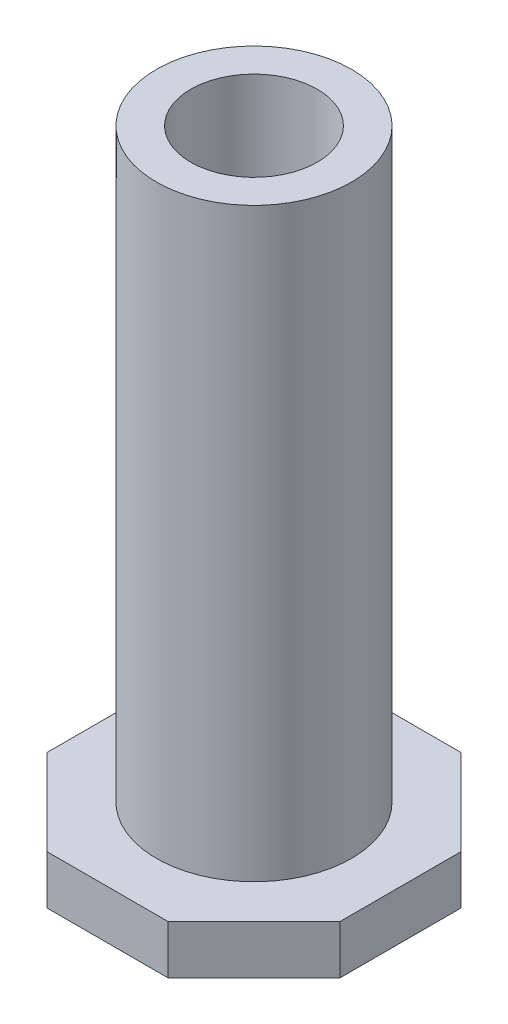
ISO-10303-21;
HEADER;
FILE_DESCRIPTION(('STEP AP214'),'2;1');
FILE_NAME('part.step','',(''),(''),'','','');
FILE_SCHEMA(('AUTOMOTIVE_DESIGN { 1 0 10303 214 1 1 1 1 }'));
ENDSEC;
DATA;
#1=APPLICATION_CONTEXT('core data for automotive mechanical design processes');
#2=APPLICATION_PROTOCOL_DEFINITION('international standard','automotive_design',2000,#1);
#3=PRODUCT_CONTEXT('',#1,'mechanical');
#4=PRODUCT('Part','Part','',(#3));
#5=PRODUCT_RELATED_PRODUCT_CATEGORY('part','',(#4));
#6=PRODUCT_DEFINITION_FORMATION('','',#4);
#7=PRODUCT_DEFINITION_CONTEXT('part definition',#1,'design');
#8=PRODUCT_DEFINITION('design','',#6,#7);
#9=PRODUCT_DEFINITION_SHAPE('','',#8);
#10=(LENGTH_UNIT() NAMED_UNIT(*) SI_UNIT(.MILLI.,.METRE.));
#11=(NAMED_UNIT(*) PLANE_ANGLE_UNIT() SI_UNIT($,.RADIAN.));
#12=(NAMED_UNIT(*) SI_UNIT($,.STERADIAN.) SOLID_ANGLE_UNIT());
#13=UNCERTAINTY_MEASURE_WITH_UNIT(LENGTH_MEASURE(1.E-05),#10,'distance_accuracy_value','');
#14=(GEOMETRIC_REPRESENTATION_CONTEXT(3) GLOBAL_UNCERTAINTY_ASSIGNED_CONTEXT((#13)) GLOBAL_UNIT_ASSIGNED_CONTEXT((#10,
#11,#12)) REPRESENTATION_CONTEXT('',''));
#15=CARTESIAN_POINT('',(0.,0.,0.));
#16=DIRECTION('',(0.,0.,1.));
#17=DIRECTION('',(1.,0.,0.));
#18=AXIS2_PLACEMENT_3D('',#15,#16,#17);
#19=CARTESIAN_POINT('',(0.,1.5875,0.));
#20=DIRECTION('',(0.,1.,0.));
#21=DIRECTION('',(0.,0.,1.));
#22=AXIS2_PLACEMENT_3D('',#19,#20,#21);
#23=PLANE('',#22);
#24=DIRECTION('',(0.707106781186547,0.,-0.707106781186548));
#25=VECTOR('',#24,1.);
#26=CARTESIAN_POINT('',(1.97269209080187,1.5875,4.7625));
#27=LINE('',#26,#25);
#28=CARTESIAN_POINT('',(1.97269209080187,1.5875,4.7625));
#29=VERTEX_POINT('',#28);
#30=CARTESIAN_POINT('',(4.7625,1.5875,1.97269209080187));
#31=VERTEX_POINT('',#30);
#32=EDGE_CURVE('E144',#29,#31,#27,.T.);
#33=ORIENTED_EDGE('',*,*,#32,.T.);
#34=DIRECTION('',(0.,0.,-1.));
#35=VECTOR('',#34,1.);
#36=CARTESIAN_POINT('',(4.7625,1.5875,1.97269209080187));
#37=LINE('',#36,#35);
#38=CARTESIAN_POINT('',(4.7625,1.5875,-1.97269209080187));
#39=VERTEX_POINT('',#38);
#40=EDGE_CURVE('E92',#31,#39,#37,.T.);
#41=ORIENTED_EDGE('',*,*,#40,.T.);
#42=DIRECTION('',(-0.707106781186548,0.,-0.707106781186547));
#43=VECTOR('',#42,1.);
#44=CARTESIAN_POINT('',(4.7625,1.5875,-1.97269209080187));
#45=LINE('',#44,#43);
#46=CARTESIAN_POINT('',(1.97269209080186,1.5875,-4.7625));
#47=VERTEX_POINT('',#46);
#48=EDGE_CURVE('E159',#39,#47,#45,.T.);
#49=ORIENTED_EDGE('',*,*,#48,.T.);
#50=DIRECTION('',(-1.,0.,0.));
#51=VECTOR('',#50,1.);
#52=CARTESIAN_POINT('',(1.97269209080186,1.5875,-4.7625));
#53=LINE('',#52,#51);
#54=CARTESIAN_POINT('',(-1.97269209080187,1.5875,-4.7625));
#55=VERTEX_POINT('',#54);
#56=EDGE_CURVE('E171',#47,#55,#53,.T.);
#57=ORIENTED_EDGE('',*,*,#56,.T.);
#58=DIRECTION('',(-0.707106781186547,0.,0.707106781186548));
#59=VECTOR('',#58,1.);
#60=CARTESIAN_POINT('',(-1.97269209080187,1.5875,-4.7625));
#61=LINE('',#60,#59);
#62=CARTESIAN_POINT('',(-4.7625,1.5875,-1.97269209080187));
#63=VERTEX_POINT('',#62);
#64=EDGE_CURVE('E111',#55,#63,#61,.T.);
#65=ORIENTED_EDGE('',*,*,#64,.T.);
#66=DIRECTION('',(0.,0.,1.));
#67=VECTOR('',#66,1.);
#68=CARTESIAN_POINT('',(-4.7625,1.5875,-1.97269209080187));
#69=LINE('',#68,#67);
#70=CARTESIAN_POINT('',(-4.7625,1.5875,1.97269209080187));
#71=VERTEX_POINT('',#70);
#72=EDGE_CURVE('E105',#63,#71,#69,.T.);
#73=ORIENTED_EDGE('',*,*,#72,.T.);
#74=DIRECTION('',(0.707106781186548,0.,0.707106781186547));
#75=VECTOR('',#74,1.);
#76=CARTESIAN_POINT('',(-4.7625,1.5875,1.97269209080187));
#77=LINE('',#76,#75);
#78=CARTESIAN_POINT('',(-1.97269209080186,1.5875,4.7625));
#79=VERTEX_POINT('',#78);
#80=EDGE_CURVE('E109',#71,#79,#77,.T.);
#81=ORIENTED_EDGE('',*,*,#80,.T.);
#82=DIRECTION('',(1.,0.,0.));
#83=VECTOR('',#82,1.);
#84=CARTESIAN_POINT('',(-1.97269209080186,1.5875,4.7625));
#85=LINE('',#84,#83);
#86=EDGE_CURVE('E49',#79,#29,#85,.T.);
#87=ORIENTED_EDGE('',*,*,#86,.T.);
#88=EDGE_LOOP('',(#33,#41,#49,#57,#65,#73,#81,#87));
#89=FACE_BOUND('',#88,.T.);
#90=CARTESIAN_POINT('',(0.,1.5875,0.));
#91=DIRECTION('',(0.,1.,0.));
#92=DIRECTION('',(0.,0.,1.));
#93=AXIS2_PLACEMENT_3D('',#90,#91,#92);
#94=CIRCLE('',#93,3.175);
#95=CARTESIAN_POINT('',(0.,1.5875,-3.175));
#96=VERTEX_POINT('',#95);
#97=EDGE_CURVE('E177',#96,#96,#94,.T.);
#98=ORIENTED_EDGE('',*,*,#97,.F.);
#99=EDGE_LOOP('',(#98));
#100=FACE_BOUND('',#99,.T.);
#101=ADVANCED_FACE('F32',(#89,#100),#23,.T.);
#102=CARTESIAN_POINT('',(1.97269209080187,1.5875,4.7625));
#103=DIRECTION('',(-0.707106781186548,0.,-0.707106781186547));
#104=DIRECTION('',(-0.707106781186547,0.,0.707106781186548));
#105=AXIS2_PLACEMENT_3D('',#102,#103,#104);
#106=PLANE('',#105);
#107=DIRECTION('',(0.707106781186547,0.,-0.707106781186548));
#108=VECTOR('',#107,1.);
#109=CARTESIAN_POINT('',(1.97269209080187,0.,4.7625));
#110=LINE('',#109,#108);
#111=CARTESIAN_POINT('',(1.97269209080187,0.,4.7625));
#112=VERTEX_POINT('',#111);
#113=CARTESIAN_POINT('',(4.7625,0.,1.97269209080187));
#114=VERTEX_POINT('',#113);
#115=EDGE_CURVE('E129',#112,#114,#110,.T.);
#116=ORIENTED_EDGE('',*,*,#115,.T.);
#117=DIRECTION('',(0.,-1.,0.));
#118=VECTOR('',#117,1.);
#119=CARTESIAN_POINT('',(4.7625,1.5875,1.97269209080187));
#120=LINE('',#119,#118);
#121=EDGE_CURVE('E11',#31,#114,#120,.T.);
#122=ORIENTED_EDGE('',*,*,#121,.F.);
#123=ORIENTED_EDGE('',*,*,#32,.F.);
#124=DIRECTION('',(0.,-1.,0.));
#125=VECTOR('',#124,1.);
#126=CARTESIAN_POINT('',(1.97269209080187,1.5875,4.7625));
#127=LINE('',#126,#125);
#128=EDGE_CURVE('E125',#29,#112,#127,.T.);
#129=ORIENTED_EDGE('',*,*,#128,.T.);
#130=EDGE_LOOP('',(#116,#122,#123,#129));
#131=FACE_BOUND('',#130,.T.);
#132=ADVANCED_FACE('F34',(#131),#106,.F.);
#133=CARTESIAN_POINT('',(4.7625,1.5875,1.97269209080187));
#134=DIRECTION('',(-1.,0.,0.));
#135=DIRECTION('',(0.,0.,1.));
#136=AXIS2_PLACEMENT_3D('',#133,#134,#135);
#137=PLANE('',#136);
#138=DIRECTION('',(0.,0.,-1.));
#139=VECTOR('',#138,1.);
#140=CARTESIAN_POINT('',(4.7625,0.,1.97269209080187));
#141=LINE('',#140,#139);
#142=CARTESIAN_POINT('',(4.7625,0.,-1.97269209080187));
#143=VERTEX_POINT('',#142);
#144=EDGE_CURVE('E132',#114,#143,#141,.T.);
#145=ORIENTED_EDGE('',*,*,#144,.T.);
#146=DIRECTION('',(0.,-1.,0.));
#147=VECTOR('',#146,1.);
#148=CARTESIAN_POINT('',(4.7625,1.5875,-1.97269209080187));
#149=LINE('',#148,#147);
#150=EDGE_CURVE('E41',#39,#143,#149,.T.);
#151=ORIENTED_EDGE('',*,*,#150,.F.);
#152=ORIENTED_EDGE('',*,*,#40,.F.);
#153=ORIENTED_EDGE('',*,*,#121,.T.);
#154=EDGE_LOOP('',(#145,#151,#152,#153));
#155=FACE_BOUND('',#154,.T.);
#156=ADVANCED_FACE('F213',(#155),#137,.F.);
#157=CARTESIAN_POINT('',(4.7625,1.5875,-1.97269209080187));
#158=DIRECTION('',(-0.707106781186547,0.,0.707106781186548));
#159=DIRECTION('',(0.707106781186548,0.,0.707106781186547));
#160=AXIS2_PLACEMENT_3D('',#157,#158,#159);
#161=PLANE('',#160);
#162=DIRECTION('',(-0.707106781186548,0.,-0.707106781186547));
#163=VECTOR('',#162,1.);
#164=CARTESIAN_POINT('',(4.7625,0.,-1.97269209080187));
#165=LINE('',#164,#163);
#166=CARTESIAN_POINT('',(1.97269209080186,0.,-4.7625));
#167=VERTEX_POINT('',#166);
#168=EDGE_CURVE('E135',#143,#167,#165,.T.);
#169=ORIENTED_EDGE('',*,*,#168,.T.);
#170=DIRECTION('',(0.,-1.,0.));
#171=VECTOR('',#170,1.);
#172=CARTESIAN_POINT('',(1.97269209080186,1.5875,-4.7625));
#173=LINE('',#172,#171);
#174=EDGE_CURVE('E151',#47,#167,#173,.T.);
#175=ORIENTED_EDGE('',*,*,#174,.F.);
#176=ORIENTED_EDGE('',*,*,#48,.F.);
#177=ORIENTED_EDGE('',*,*,#150,.T.);
#178=EDGE_LOOP('',(#169,#175,#176,#177));
#179=FACE_BOUND('',#178,.T.);
#180=ADVANCED_FACE('F157',(#179),#161,.F.);
#181=CARTESIAN_POINT('',(1.97269209080186,1.5875,-4.7625));
#182=DIRECTION('',(0.,0.,1.));
#183=DIRECTION('',(1.,0.,0.));
#184=AXIS2_PLACEMENT_3D('',#181,#182,#183);
#185=PLANE('',#184);
#186=DIRECTION('',(-1.,0.,0.));
#187=VECTOR('',#186,1.);
#188=CARTESIAN_POINT('',(1.97269209080186,0.,-4.7625));
#189=LINE('',#188,#187);
#190=CARTESIAN_POINT('',(-1.97269209080187,0.,-4.7625));
#191=VERTEX_POINT('',#190);
#192=EDGE_CURVE('E137',#167,#191,#189,.T.);
#193=ORIENTED_EDGE('',*,*,#192,.T.);
#194=DIRECTION('',(0.,-1.,0.));
#195=VECTOR('',#194,1.);
#196=CARTESIAN_POINT('',(-1.97269209080187,1.5875,-4.7625));
#197=LINE('',#196,#195);
#198=EDGE_CURVE('E148',#55,#191,#197,.T.);
#199=ORIENTED_EDGE('',*,*,#198,.F.);
#200=ORIENTED_EDGE('',*,*,#56,.F.);
#201=ORIENTED_EDGE('',*,*,#174,.T.);
#202=EDGE_LOOP('',(#193,#199,#200,#201));
#203=FACE_BOUND('',#202,.T.);
#204=ADVANCED_FACE('F167',(#203),#185,.F.);
#205=CARTESIAN_POINT('',(-1.97269209080187,1.5875,-4.7625));
#206=DIRECTION('',(0.707106781186548,0.,0.707106781186547));
#207=DIRECTION('',(0.707106781186547,0.,-0.707106781186548));
#208=AXIS2_PLACEMENT_3D('',#205,#206,#207);
#209=PLANE('',#208);
#210=DIRECTION('',(-0.707106781186547,0.,0.707106781186548));
#211=VECTOR('',#210,1.);
#212=CARTESIAN_POINT('',(-1.97269209080187,0.,-4.7625));
#213=LINE('',#212,#211);
#214=CARTESIAN_POINT('',(-4.7625,0.,-1.97269209080187));
#215=VERTEX_POINT('',#214);
#216=EDGE_CURVE('E139',#191,#215,#213,.T.);
#217=ORIENTED_EDGE('',*,*,#216,.T.);
#218=DIRECTION('',(0.,-1.,0.));
#219=VECTOR('',#218,1.);
#220=CARTESIAN_POINT('',(-4.7625,1.5875,-1.97269209080187));
#221=LINE('',#220,#219);
#222=EDGE_CURVE('E120',#63,#215,#221,.T.);
#223=ORIENTED_EDGE('',*,*,#222,.F.);
#224=ORIENTED_EDGE('',*,*,#64,.F.);
#225=ORIENTED_EDGE('',*,*,#198,.T.);
#226=EDGE_LOOP('',(#217,#223,#224,#225));
#227=FACE_BOUND('',#226,.T.);
#228=ADVANCED_FACE('F170',(#227),#209,.F.);
#229=CARTESIAN_POINT('',(-4.7625,1.5875,-1.97269209080187));
#230=DIRECTION('',(1.,0.,0.));
#231=DIRECTION('',(0.,0.,-1.));
#232=AXIS2_PLACEMENT_3D('',#229,#230,#231);
#233=PLANE('',#232);
#234=DIRECTION('',(0.,0.,1.));
#235=VECTOR('',#234,1.);
#236=CARTESIAN_POINT('',(-4.7625,0.,-1.97269209080187));
#237=LINE('',#236,#235);
#238=CARTESIAN_POINT('',(-4.7625,0.,1.97269209080187));
#239=VERTEX_POINT('',#238);
#240=EDGE_CURVE('E119',#215,#239,#237,.T.);
#241=ORIENTED_EDGE('',*,*,#240,.T.);
#242=DIRECTION('',(0.,-1.,0.));
#243=VECTOR('',#242,1.);
#244=CARTESIAN_POINT('',(-4.7625,1.5875,1.97269209080187));
#245=LINE('',#244,#243);
#246=EDGE_CURVE('E116',#71,#239,#245,.T.);
#247=ORIENTED_EDGE('',*,*,#246,.F.);
#248=ORIENTED_EDGE('',*,*,#72,.F.);
#249=ORIENTED_EDGE('',*,*,#222,.T.);
#250=EDGE_LOOP('',(#241,#247,#248,#249));
#251=FACE_BOUND('',#250,.T.);
#252=ADVANCED_FACE('F117',(#251),#233,.F.);
#253=CARTESIAN_POINT('',(-4.7625,1.5875,1.97269209080187));
#254=DIRECTION('',(0.707106781186547,0.,-0.707106781186548));
#255=DIRECTION('',(-0.707106781186548,0.,-0.707106781186547));
#256=AXIS2_PLACEMENT_3D('',#253,#254,#255);
#257=PLANE('',#256);
#258=DIRECTION('',(0.707106781186548,0.,0.707106781186547));
#259=VECTOR('',#258,1.);
#260=CARTESIAN_POINT('',(-4.7625,0.,1.97269209080187));
#261=LINE('',#260,#259);
#262=CARTESIAN_POINT('',(-1.97269209080186,0.,4.7625));
#263=VERTEX_POINT('',#262);
#264=EDGE_CURVE('E78',#239,#263,#261,.T.);
#265=ORIENTED_EDGE('',*,*,#264,.T.);
#266=DIRECTION('',(0.,-1.,0.));
#267=VECTOR('',#266,1.);
#268=CARTESIAN_POINT('',(-1.97269209080186,1.5875,4.7625));
#269=LINE('',#268,#267);
#270=EDGE_CURVE('E121',#79,#263,#269,.T.);
#271=ORIENTED_EDGE('',*,*,#270,.F.);
#272=ORIENTED_EDGE('',*,*,#80,.F.);
#273=ORIENTED_EDGE('',*,*,#246,.T.);
#274=EDGE_LOOP('',(#265,#271,#272,#273));
#275=FACE_BOUND('',#274,.T.);
#276=ADVANCED_FACE('F123',(#275),#257,.F.);
#277=CARTESIAN_POINT('',(-1.97269209080186,1.5875,4.7625));
#278=DIRECTION('',(0.,0.,-1.));
#279=DIRECTION('',(-1.,0.,0.));
#280=AXIS2_PLACEMENT_3D('',#277,#278,#279);
#281=PLANE('',#280);
#282=DIRECTION('',(1.,0.,0.));
#283=VECTOR('',#282,1.);
#284=CARTESIAN_POINT('',(-1.97269209080186,0.,4.7625));
#285=LINE('',#284,#283);
#286=EDGE_CURVE('E84',#263,#112,#285,.T.);
#287=ORIENTED_EDGE('',*,*,#286,.T.);
#288=ORIENTED_EDGE('',*,*,#128,.F.);
#289=ORIENTED_EDGE('',*,*,#86,.F.);
#290=ORIENTED_EDGE('',*,*,#270,.T.);
#291=EDGE_LOOP('',(#287,#288,#289,#290));
#292=FACE_BOUND('',#291,.T.);
#293=ADVANCED_FACE('F218',(#292),#281,.F.);
#294=CARTESIAN_POINT('',(0.,0.,0.));
#295=DIRECTION('',(0.,1.,0.));
#296=DIRECTION('',(0.,0.,1.));
#297=AXIS2_PLACEMENT_3D('',#294,#295,#296);
#298=PLANE('',#297);
#299=ORIENTED_EDGE('',*,*,#115,.F.);
#300=ORIENTED_EDGE('',*,*,#286,.F.);
#301=ORIENTED_EDGE('',*,*,#264,.F.);
#302=ORIENTED_EDGE('',*,*,#240,.F.);
#303=ORIENTED_EDGE('',*,*,#216,.F.);
#304=ORIENTED_EDGE('',*,*,#192,.F.);
#305=ORIENTED_EDGE('',*,*,#168,.F.);
#306=ORIENTED_EDGE('',*,*,#144,.F.);
#307=EDGE_LOOP('',(#299,#300,#301,#302,#303,#304,#305,#306));
#308=FACE_BOUND('',#307,.T.);
#309=ADVANCED_FACE('F163',(#308),#298,.F.);
#310=CARTESIAN_POINT('',(0.,20.6375,0.));
#311=DIRECTION('',(0.,-1.,0.));
#312=DIRECTION('',(0.,0.,-1.));
#313=AXIS2_PLACEMENT_3D('',#310,#311,#312);
#314=CYLINDRICAL_SURFACE('',#313,3.175);
#315=CARTESIAN_POINT('',(0.,20.6375,0.));
#316=DIRECTION('',(0.,1.,0.));
#317=DIRECTION('',(0.,0.,1.));
#318=AXIS2_PLACEMENT_3D('',#315,#316,#317);
#319=CIRCLE('',#318,3.175);
#320=CARTESIAN_POINT('',(0.,20.6375,-3.175));
#321=VERTEX_POINT('',#320);
#322=EDGE_CURVE('E133',#321,#321,#319,.T.);
#323=CARTESIAN_POINT('',(0.,20.6375,-3.175));
#324=CARTESIAN_POINT('',(0.,20.4390625,-3.175));
#325=CARTESIAN_POINT('',(0.,20.240625,-3.175));
#326=CARTESIAN_POINT('',(0.,19.84375,-3.175));
#327=CARTESIAN_POINT('',(0.,19.6453125,-3.175));
#328=CARTESIAN_POINT('',(0.,19.2484375,-3.175));
#329=CARTESIAN_POINT('',(0.,19.05,-3.175));
#330=CARTESIAN_POINT('',(0.,18.653125,-3.175));
#331=CARTESIAN_POINT('',(0.,18.4546875,-3.175));
#332=CARTESIAN_POINT('',(0.,18.0578125,-3.175));
#333=CARTESIAN_POINT('',(0.,17.859375,-3.175));
#334=CARTESIAN_POINT('',(0.,17.4625,-3.175));
#335=CARTESIAN_POINT('',(0.,17.2640625,-3.175));
#336=CARTESIAN_POINT('',(0.,16.8671875,-3.175));
#337=CARTESIAN_POINT('',(0.,16.66875,-3.175));
#338=CARTESIAN_POINT('',(0.,16.271875,-3.175));
#339=CARTESIAN_POINT('',(0.,16.0734375,-3.175));
#340=CARTESIAN_POINT('',(0.,15.6765625,-3.175));
#341=CARTESIAN_POINT('',(0.,15.478125,-3.175));
#342=CARTESIAN_POINT('',(0.,15.08125,-3.175));
#343=CARTESIAN_POINT('',(0.,14.8828125,-3.175));
#344=CARTESIAN_POINT('',(0.,14.4859375,-3.175));
#345=CARTESIAN_POINT('',(0.,14.2875,-3.175));
#346=CARTESIAN_POINT('',(0.,13.890625,-3.175));
#347=CARTESIAN_POINT('',(0.,13.6921875,-3.175));
#348=CARTESIAN_POINT('',(0.,13.2953125,-3.175));
#349=CARTESIAN_POINT('',(0.,13.096875,-3.175));
#350=CARTESIAN_POINT('',(0.,12.7,-3.175));
#351=CARTESIAN_POINT('',(0.,12.5015625,-3.175));
#352=CARTESIAN_POINT('',(0.,12.1046875,-3.175));
#353=CARTESIAN_POINT('',(0.,11.90625,-3.175));
#354=CARTESIAN_POINT('',(0.,11.509375,-3.175));
#355=CARTESIAN_POINT('',(0.,11.3109375,-3.175));
#356=CARTESIAN_POINT('',(0.,10.9140625,-3.175));
#357=CARTESIAN_POINT('',(0.,10.715625,-3.175));
#358=CARTESIAN_POINT('',(0.,10.31875,-3.175));
#359=CARTESIAN_POINT('',(0.,10.1203125,-3.175));
#360=CARTESIAN_POINT('',(0.,9.7234375,-3.175));
#361=CARTESIAN_POINT('',(0.,9.525,-3.175));
#362=CARTESIAN_POINT('',(0.,9.128125,-3.175));
#363=CARTESIAN_POINT('',(0.,8.9296875,-3.175));
#364=CARTESIAN_POINT('',(0.,8.5328125,-3.175));
#365=CARTESIAN_POINT('',(0.,8.334375,-3.175));
#366=CARTESIAN_POINT('',(0.,7.9375,-3.175));
#367=CARTESIAN_POINT('',(0.,7.7390625,-3.175));
#368=CARTESIAN_POINT('',(0.,7.3421875,-3.175));
#369=CARTESIAN_POINT('',(0.,7.14375,-3.175));
#370=CARTESIAN_POINT('',(0.,6.746875,-3.175));
#371=CARTESIAN_POINT('',(0.,6.5484375,-3.175));
#372=CARTESIAN_POINT('',(0.,6.1515625,-3.175));
#373=CARTESIAN_POINT('',(0.,5.953125,-3.175));
#374=CARTESIAN_POINT('',(0.,5.55625,-3.175));
#375=CARTESIAN_POINT('',(0.,5.3578125,-3.175));
#376=CARTESIAN_POINT('',(0.,4.9609375,-3.175));
#377=CARTESIAN_POINT('',(0.,4.7625,-3.175));
#378=CARTESIAN_POINT('',(0.,4.365625,-3.175));
#379=CARTESIAN_POINT('',(0.,4.1671875,-3.175));
#380=CARTESIAN_POINT('',(0.,3.7703125,-3.175));
#381=CARTESIAN_POINT('',(0.,3.571875,-3.175));
#382=CARTESIAN_POINT('',(0.,3.175,-3.175));
#383=CARTESIAN_POINT('',(0.,2.9765625,-3.175));
#384=CARTESIAN_POINT('',(0.,2.5796875,-3.175));
#385=CARTESIAN_POINT('',(0.,2.38125,-3.175));
#386=CARTESIAN_POINT('',(0.,1.984375,-3.175));
#387=CARTESIAN_POINT('',(0.,1.7859375,-3.175));
#388=CARTESIAN_POINT('',(0.,1.5875,-3.175));
#389=B_SPLINE_CURVE_WITH_KNOTS('',3,(#323,#324,#325,#326,#327,#328,#329,#330,#331,#332,#333,
#334,#335,#336,#337,#338,#339,#340,#341,#342,#343,#344,#345,#346,#347,#348,#349,#350,#351,#352,
#353,#354,#355,#356,#357,#358,#359,#360,#361,#362,#363,#364,#365,#366,#367,#368,#369,#370,#371,
#372,#373,#374,#375,#376,#377,#378,#379,#380,#381,#382,#383,#384,#385,#386,#387,#388),
.UNSPECIFIED.,.F.,.F.,(4,2,2,2,2,2,2,2,2,2,2,2,2,2,2,2,2,2,2,2,2,2,2,2,2,2,2,2,2,2,2,2,4),(0.,
0.595312499999997,1.190625,1.7859375,2.38125,2.9765625,3.571875,4.1671875,4.7625,5.3578125,
5.953125,6.5484375,7.14375,7.7390625,8.334375,8.9296875,9.525,10.1203125,10.715625,11.3109375,
11.90625,12.5015625,13.096875,13.6921875,14.2875,14.8828125,15.478125,16.0734375,16.66875,
17.2640625,17.859375,18.4546875,19.05),.UNSPECIFIED.);
#390=EDGE_CURVE('BSEAM200',#321,#96,#389,.T.);
#391=ORIENTED_EDGE('',*,*,#322,.F.);
#392=ORIENTED_EDGE('',*,*,#97,.T.);
#393=ORIENTED_EDGE('',*,*,#390,.T.);
#394=ORIENTED_EDGE('',*,*,#390,.F.);
#395=EDGE_LOOP('',(#391,#393,#392,#394));
#396=FACE_BOUND('',#395,.T.);
#397=ADVANCED_FACE('F200',(#396),#314,.T.);
#398=CARTESIAN_POINT('',(0.,20.6375,0.));
#399=DIRECTION('',(0.,1.,0.));
#400=DIRECTION('',(0.,0.,1.));
#401=AXIS2_PLACEMENT_3D('',#398,#399,#400);
#402=PLANE('',#401);
#403=CARTESIAN_POINT('',(0.,20.6375,0.));
#404=DIRECTION('',(0.,1.,0.));
#405=DIRECTION('',(0.,0.,1.));
#406=AXIS2_PLACEMENT_3D('',#403,#404,#405);
#407=CIRCLE('',#406,2.0574);
#408=CARTESIAN_POINT('',(0.,20.6375,2.0574));
#409=VERTEX_POINT('',#408);
#410=EDGE_CURVE('E183',#409,#409,#407,.T.);
#411=ORIENTED_EDGE('',*,*,#410,.F.);
#412=EDGE_LOOP('',(#411));
#413=FACE_BOUND('',#412,.T.);
#414=ORIENTED_EDGE('',*,*,#322,.T.);
#415=EDGE_LOOP('',(#414));
#416=FACE_BOUND('',#415,.T.);
#417=ADVANCED_FACE('F194',(#413,#416),#402,.T.);
#418=CARTESIAN_POINT('',(0.,14.2875,0.));
#419=DIRECTION('',(0.,1.,0.));
#420=DIRECTION('',(0.,0.,1.));
#421=AXIS2_PLACEMENT_3D('',#418,#419,#420);
#422=CYLINDRICAL_SURFACE('',#421,2.0574);
#423=CARTESIAN_POINT('',(0.,14.2875,0.));
#424=DIRECTION('',(0.,1.,0.));
#425=DIRECTION('',(0.,0.,1.));
#426=AXIS2_PLACEMENT_3D('',#423,#424,#425);
#427=CIRCLE('',#426,2.0574);
#428=CARTESIAN_POINT('',(0.,14.2875,2.0574));
#429=VERTEX_POINT('',#428);
#430=EDGE_CURVE('E180',#429,#429,#427,.T.);
#431=ORIENTED_EDGE('',*,*,#430,.F.);
#432=EDGE_LOOP('',(#431));
#433=FACE_BOUND('',#432,.T.);
#434=ORIENTED_EDGE('',*,*,#410,.T.);
#435=EDGE_LOOP('',(#434));
#436=FACE_BOUND('',#435,.T.);
#437=ADVANCED_FACE('F191',(#433,#436),#422,.F.);
#438=CARTESIAN_POINT('',(0.,14.2875,0.));
#439=DIRECTION('',(0.,1.,0.));
#440=DIRECTION('',(0.,0.,1.));
#441=AXIS2_PLACEMENT_3D('',#438,#439,#440);
#442=PLANE('',#441);
#443=ORIENTED_EDGE('',*,*,#430,.T.);
#444=EDGE_LOOP('',(#443));
#445=FACE_BOUND('',#444,.T.);
#446=ADVANCED_FACE('F189',(#445),#442,.T.);
#447=CLOSED_SHELL('',(#101,#132,#156,#180,#204,#228,#252,#276,#293,#309,#397,#417,#437,#446));
#448=MANIFOLD_SOLID_BREP('B2',#447);
#449=ADVANCED_BREP_SHAPE_REPRESENTATION('',(#18,#448),#14);
#450=SHAPE_DEFINITION_REPRESENTATION(#9,#449);
ENDSEC;
END-ISO-10303-21;
